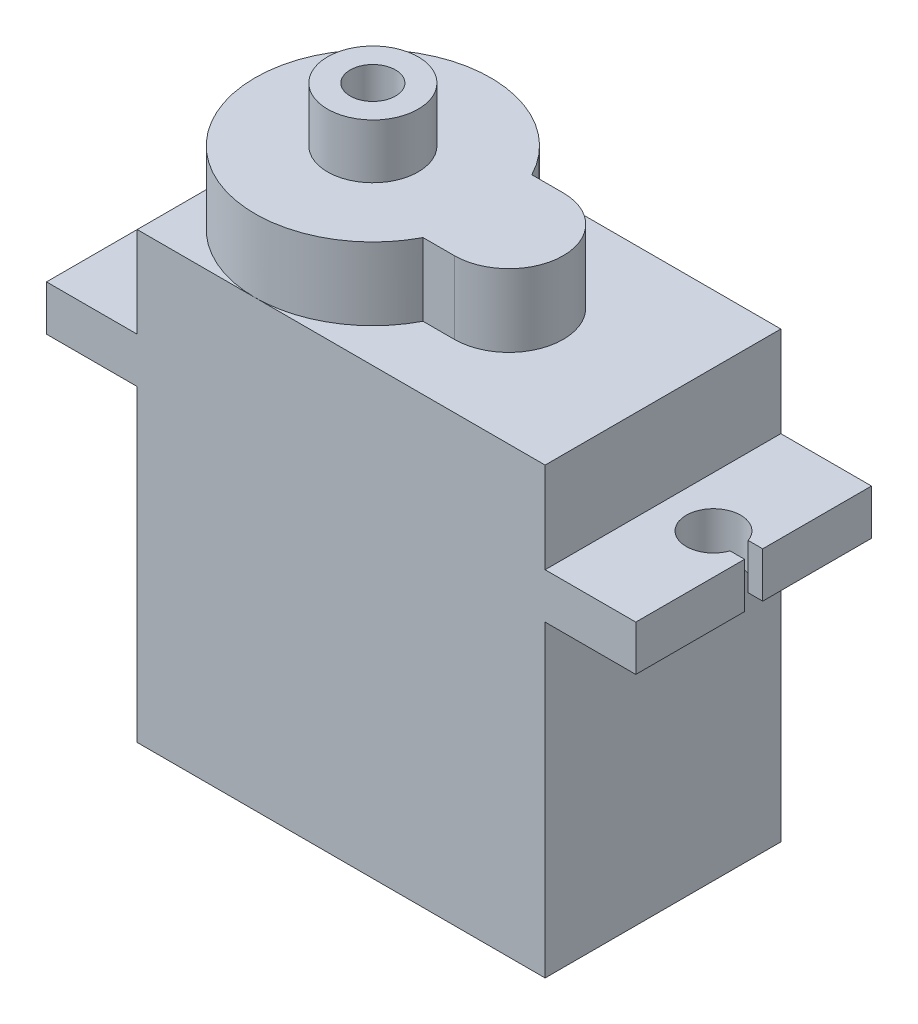
ISO-10303-21;
HEADER;
FILE_DESCRIPTION(('STEP AP214'),'2;1');
FILE_NAME('part.step','',(''),(''),'','','');
FILE_SCHEMA(('AUTOMOTIVE_DESIGN { 1 0 10303 214 1 1 1 1 }'));
ENDSEC;
DATA;
#1=APPLICATION_CONTEXT('core data for automotive mechanical design processes');
#2=APPLICATION_PROTOCOL_DEFINITION('international standard','automotive_design',2000,#1);
#3=PRODUCT_CONTEXT('',#1,'mechanical');
#4=PRODUCT('Part','Part','',(#3));
#5=PRODUCT_RELATED_PRODUCT_CATEGORY('part','',(#4));
#6=PRODUCT_DEFINITION_FORMATION('','',#4);
#7=PRODUCT_DEFINITION_CONTEXT('part definition',#1,'design');
#8=PRODUCT_DEFINITION('design','',#6,#7);
#9=PRODUCT_DEFINITION_SHAPE('','',#8);
#10=(LENGTH_UNIT() NAMED_UNIT(*) SI_UNIT(.MILLI.,.METRE.));
#11=(NAMED_UNIT(*) PLANE_ANGLE_UNIT() SI_UNIT($,.RADIAN.));
#12=(NAMED_UNIT(*) SI_UNIT($,.STERADIAN.) SOLID_ANGLE_UNIT());
#13=UNCERTAINTY_MEASURE_WITH_UNIT(LENGTH_MEASURE(1.E-05),#10,'distance_accuracy_value','');
#14=(GEOMETRIC_REPRESENTATION_CONTEXT(3) GLOBAL_UNCERTAINTY_ASSIGNED_CONTEXT((#13)) GLOBAL_UNIT_ASSIGNED_CONTEXT((#10,
#11,#12)) REPRESENTATION_CONTEXT('',''));
#15=CARTESIAN_POINT('',(0.,0.,0.));
#16=DIRECTION('',(0.,0.,1.));
#17=DIRECTION('',(1.,0.,0.));
#18=AXIS2_PLACEMENT_3D('',#15,#16,#17);
#19=CARTESIAN_POINT('',(-16.25,11.,-6.5));
#20=DIRECTION('',(-1.,0.,0.));
#21=DIRECTION('',(0.,0.,1.));
#22=AXIS2_PLACEMENT_3D('',#19,#20,#21);
#23=PLANE('',#22);
#24=DIRECTION('',(0.,1.,0.));
#25=VECTOR('',#24,1.);
#26=CARTESIAN_POINT('',(-16.25,-8.5,-0.5));
#27=LINE('',#26,#25);
#28=CARTESIAN_POINT('',(-16.25,8.5,-0.5));
#29=VERTEX_POINT('',#28);
#30=CARTESIAN_POINT('',(-16.25,11.,-0.5));
#31=VERTEX_POINT('',#30);
#32=EDGE_CURVE('E214',#29,#31,#27,.T.);
#33=ORIENTED_EDGE('',*,*,#32,.T.);
#34=DIRECTION('',(0.,0.,1.));
#35=VECTOR('',#34,1.);
#36=CARTESIAN_POINT('',(-16.25,11.,-6.5));
#37=LINE('',#36,#35);
#38=CARTESIAN_POINT('',(-16.25,11.,-6.5));
#39=VERTEX_POINT('',#38);
#40=EDGE_CURVE('E279',#39,#31,#37,.T.);
#41=ORIENTED_EDGE('',*,*,#40,.F.);
#42=DIRECTION('',(0.,-1.,0.));
#43=VECTOR('',#42,1.);
#44=CARTESIAN_POINT('',(-16.25,11.,-6.5));
#45=LINE('',#44,#43);
#46=CARTESIAN_POINT('',(-16.25,8.5,-6.5));
#47=VERTEX_POINT('',#46);
#48=EDGE_CURVE('E361',#39,#47,#45,.T.);
#49=ORIENTED_EDGE('',*,*,#48,.T.);
#50=DIRECTION('',(0.,0.,1.));
#51=VECTOR('',#50,1.);
#52=CARTESIAN_POINT('',(-16.25,8.5,-6.5));
#53=LINE('',#52,#51);
#54=EDGE_CURVE('E288',#47,#29,#53,.T.);
#55=ORIENTED_EDGE('',*,*,#54,.T.);
#56=EDGE_LOOP('',(#33,#41,#49,#55));
#57=FACE_BOUND('',#56,.T.);
#58=ADVANCED_FACE('F38',(#57),#23,.T.);
#59=CARTESIAN_POINT('',(16.25,8.5,-6.5));
#60=DIRECTION('',(1.,0.,0.));
#61=DIRECTION('',(0.,0.,-1.));
#62=AXIS2_PLACEMENT_3D('',#59,#60,#61);
#63=PLANE('',#62);
#64=DIRECTION('',(0.,1.,0.));
#65=VECTOR('',#64,1.);
#66=CARTESIAN_POINT('',(16.25,-8.5,-0.499999999999999));
#67=LINE('',#66,#65);
#68=CARTESIAN_POINT('',(16.25,8.5,-0.499999999999999));
#69=VERTEX_POINT('',#68);
#70=CARTESIAN_POINT('',(16.25,11.,-0.499999999999999));
#71=VERTEX_POINT('',#70);
#72=EDGE_CURVE('E223',#69,#71,#67,.T.);
#73=ORIENTED_EDGE('',*,*,#72,.F.);
#74=DIRECTION('',(0.,0.,1.));
#75=VECTOR('',#74,1.);
#76=CARTESIAN_POINT('',(16.25,8.5,-6.5));
#77=LINE('',#76,#75);
#78=CARTESIAN_POINT('',(16.25,8.5,-6.5));
#79=VERTEX_POINT('',#78);
#80=EDGE_CURVE('E231',#79,#69,#77,.T.);
#81=ORIENTED_EDGE('',*,*,#80,.F.);
#82=DIRECTION('',(0.,1.,0.));
#83=VECTOR('',#82,1.);
#84=CARTESIAN_POINT('',(16.25,8.5,-6.5));
#85=LINE('',#84,#83);
#86=CARTESIAN_POINT('',(16.25,11.,-6.5));
#87=VERTEX_POINT('',#86);
#88=EDGE_CURVE('E347',#79,#87,#85,.T.);
#89=ORIENTED_EDGE('',*,*,#88,.T.);
#90=DIRECTION('',(0.,0.,1.));
#91=VECTOR('',#90,1.);
#92=CARTESIAN_POINT('',(16.25,11.,-6.5));
#93=LINE('',#92,#91);
#94=EDGE_CURVE('E230',#87,#71,#93,.T.);
#95=ORIENTED_EDGE('',*,*,#94,.T.);
#96=EDGE_LOOP('',(#73,#81,#89,#95));
#97=FACE_BOUND('',#96,.T.);
#98=ADVANCED_FACE('F470',(#97),#63,.T.);
#99=CARTESIAN_POINT('',(11.25,16.,-6.5));
#100=DIRECTION('',(0.,1.,0.));
#101=DIRECTION('',(-1.,0.,0.));
#102=AXIS2_PLACEMENT_3D('',#99,#100,#101);
#103=PLANE('',#102);
#104=CARTESIAN_POINT('',(-4.75,16.,0.));
#105=DIRECTION('',(0.,1.,0.));
#106=DIRECTION('',(-1.,0.,0.));
#107=AXIS2_PLACEMENT_3D('',#104,#105,#106);
#108=CIRCLE('',#107,6.5);
#109=CARTESIAN_POINT('',(1.0162812973354,16.,-3.));
#110=VERTEX_POINT('',#109);
#111=CARTESIAN_POINT('',(-4.75,16.,-6.5));
#112=VERTEX_POINT('',#111);
#113=EDGE_CURVE('E371',#110,#112,#108,.T.);
#114=ORIENTED_EDGE('',*,*,#113,.F.);
#115=DIRECTION('',(1.,0.,0.));
#116=VECTOR('',#115,1.);
#117=CARTESIAN_POINT('',(0.,16.,-3.));
#118=LINE('',#117,#116);
#119=CARTESIAN_POINT('',(2.75,16.,-3.));
#120=VERTEX_POINT('',#119);
#121=EDGE_CURVE('E395',#110,#120,#118,.T.);
#122=ORIENTED_EDGE('',*,*,#121,.T.);
#123=CARTESIAN_POINT('',(2.75,16.,0.));
#124=DIRECTION('',(0.,1.,0.));
#125=DIRECTION('',(-1.,0.,0.));
#126=AXIS2_PLACEMENT_3D('',#123,#124,#125);
#127=CIRCLE('',#126,3.);
#128=CARTESIAN_POINT('',(2.75,16.,3.));
#129=VERTEX_POINT('',#128);
#130=EDGE_CURVE('E407',#129,#120,#127,.T.);
#131=ORIENTED_EDGE('',*,*,#130,.F.);
#132=DIRECTION('',(1.,0.,0.));
#133=VECTOR('',#132,1.);
#134=CARTESIAN_POINT('',(0.,16.,3.));
#135=LINE('',#134,#133);
#136=CARTESIAN_POINT('',(1.0162812973354,16.,3.));
#137=VERTEX_POINT('',#136);
#138=EDGE_CURVE('E404',#137,#129,#135,.T.);
#139=ORIENTED_EDGE('',*,*,#138,.F.);
#140=CARTESIAN_POINT('',(-4.75,16.,6.5));
#141=VERTEX_POINT('',#140);
#142=EDGE_CURVE('E365',#141,#137,#108,.T.);
#143=ORIENTED_EDGE('',*,*,#142,.F.);
#144=DIRECTION('',(-1.,0.,0.));
#145=VECTOR('',#144,1.);
#146=CARTESIAN_POINT('',(11.25,16.,6.5));
#147=LINE('',#146,#145);
#148=CARTESIAN_POINT('',(11.25,16.,6.5));
#149=VERTEX_POINT('',#148);
#150=EDGE_CURVE('E319',#149,#141,#147,.T.);
#151=ORIENTED_EDGE('',*,*,#150,.F.);
#152=DIRECTION('',(0.,0.,1.));
#153=VECTOR('',#152,1.);
#154=CARTESIAN_POINT('',(11.25,16.,-6.5));
#155=LINE('',#154,#153);
#156=CARTESIAN_POINT('',(11.25,16.,-6.5));
#157=VERTEX_POINT('',#156);
#158=EDGE_CURVE('E297',#157,#149,#155,.T.);
#159=ORIENTED_EDGE('',*,*,#158,.F.);
#160=DIRECTION('',(-1.,0.,0.));
#161=VECTOR('',#160,1.);
#162=CARTESIAN_POINT('',(11.25,16.,-6.5));
#163=LINE('',#162,#161);
#164=EDGE_CURVE('E354',#157,#112,#163,.T.);
#165=ORIENTED_EDGE('',*,*,#164,.T.);
#166=EDGE_LOOP('',(#114,#122,#131,#139,#143,#151,#159,#165));
#167=FACE_BOUND('',#166,.T.);
#168=ADVANCED_FACE('F491',(#167),#103,.T.);
#169=CARTESIAN_POINT('',(-11.25,16.,0.));
#170=VERTEX_POINT('',#169);
#171=EDGE_CURVE('E251',#112,#170,#108,.T.);
#172=ORIENTED_EDGE('',*,*,#171,.F.);
#173=CARTESIAN_POINT('',(-11.25,16.,-6.5));
#174=VERTEX_POINT('',#173);
#175=EDGE_CURVE('E353',#112,#174,#163,.T.);
#176=ORIENTED_EDGE('',*,*,#175,.T.);
#177=DIRECTION('',(0.,0.,1.));
#178=VECTOR('',#177,1.);
#179=CARTESIAN_POINT('',(-11.25,16.,-6.5));
#180=LINE('',#179,#178);
#181=EDGE_CURVE('E294',#174,#170,#180,.T.);
#182=ORIENTED_EDGE('',*,*,#181,.T.);
#183=EDGE_LOOP('',(#172,#176,#182));
#184=FACE_BOUND('',#183,.T.);
#185=ADVANCED_FACE('F504',(#184),#103,.T.);
#186=CARTESIAN_POINT('',(-11.25,8.5,-6.5));
#187=DIRECTION('',(-1.,0.,0.));
#188=DIRECTION('',(0.,-1.,0.));
#189=AXIS2_PLACEMENT_3D('',#186,#187,#188);
#190=PLANE('',#189);
#191=DIRECTION('',(0.,0.,1.));
#192=VECTOR('',#191,1.);
#193=CARTESIAN_POINT('',(-11.25,-8.5,-6.5));
#194=LINE('',#193,#192);
#195=CARTESIAN_POINT('',(-11.25,-8.5,-6.5));
#196=VERTEX_POINT('',#195);
#197=CARTESIAN_POINT('',(-11.25,-8.5,6.5));
#198=VERTEX_POINT('',#197);
#199=EDGE_CURVE('E244',#196,#198,#194,.T.);
#200=ORIENTED_EDGE('',*,*,#199,.T.);
#201=DIRECTION('',(0.,-1.,0.));
#202=VECTOR('',#201,1.);
#203=CARTESIAN_POINT('',(-11.25,8.5,6.5));
#204=LINE('',#203,#202);
#205=CARTESIAN_POINT('',(-11.25,8.5,6.5));
#206=VERTEX_POINT('',#205);
#207=EDGE_CURVE('E422',#206,#198,#204,.T.);
#208=ORIENTED_EDGE('',*,*,#207,.F.);
#209=DIRECTION('',(0.,0.,1.));
#210=VECTOR('',#209,1.);
#211=CARTESIAN_POINT('',(-11.25,8.5,-6.5));
#212=LINE('',#211,#210);
#213=CARTESIAN_POINT('',(-11.25,8.5,-6.5));
#214=VERTEX_POINT('',#213);
#215=EDGE_CURVE('E364',#214,#206,#212,.T.);
#216=ORIENTED_EDGE('',*,*,#215,.F.);
#217=DIRECTION('',(0.,-1.,0.));
#218=VECTOR('',#217,1.);
#219=CARTESIAN_POINT('',(-11.25,8.5,-6.5));
#220=LINE('',#219,#218);
#221=EDGE_CURVE('E335',#214,#196,#220,.T.);
#222=ORIENTED_EDGE('',*,*,#221,.T.);
#223=EDGE_LOOP('',(#200,#208,#216,#222));
#224=FACE_BOUND('',#223,.T.);
#225=ADVANCED_FACE('F40',(#224),#190,.T.);
#226=CARTESIAN_POINT('',(-16.25,8.5,-6.5));
#227=DIRECTION('',(0.,-1.,0.));
#228=DIRECTION('',(0.,0.,-1.));
#229=AXIS2_PLACEMENT_3D('',#226,#227,#228);
#230=PLANE('',#229);
#231=DIRECTION('',(1.,0.,0.));
#232=VECTOR('',#231,1.);
#233=CARTESIAN_POINT('',(-16.25,8.5,-0.5));
#234=LINE('',#233,#232);
#235=CARTESIAN_POINT('',(-15.45,8.5,-0.5));
#236=VERTEX_POINT('',#235);
#237=EDGE_CURVE('E274',#29,#236,#234,.T.);
#238=ORIENTED_EDGE('',*,*,#237,.F.);
#239=ORIENTED_EDGE('',*,*,#54,.F.);
#240=DIRECTION('',(1.,0.,0.));
#241=VECTOR('',#240,1.);
#242=CARTESIAN_POINT('',(-16.25,8.5,-6.5));
#243=LINE('',#242,#241);
#244=EDGE_CURVE('E246',#47,#214,#243,.T.);
#245=ORIENTED_EDGE('',*,*,#244,.T.);
#246=ORIENTED_EDGE('',*,*,#215,.T.);
#247=DIRECTION('',(1.,0.,0.));
#248=VECTOR('',#247,1.);
#249=CARTESIAN_POINT('',(-16.25,8.5,6.5));
#250=LINE('',#249,#248);
#251=CARTESIAN_POINT('',(-16.25,8.5,6.5));
#252=VERTEX_POINT('',#251);
#253=EDGE_CURVE('E332',#252,#206,#250,.T.);
#254=ORIENTED_EDGE('',*,*,#253,.F.);
#255=CARTESIAN_POINT('',(-16.25,8.5,0.5));
#256=VERTEX_POINT('',#255);
#257=EDGE_CURVE('E285',#256,#252,#53,.T.);
#258=ORIENTED_EDGE('',*,*,#257,.F.);
#259=DIRECTION('',(-1.,0.,0.));
#260=VECTOR('',#259,1.);
#261=CARTESIAN_POINT('',(-16.25,8.5,0.5));
#262=LINE('',#261,#260);
#263=CARTESIAN_POINT('',(-15.45,8.5,0.5));
#264=VERTEX_POINT('',#263);
#265=EDGE_CURVE('E382',#264,#256,#262,.T.);
#266=ORIENTED_EDGE('',*,*,#265,.F.);
#267=CARTESIAN_POINT('',(-14.0357864376269,8.5,0.));
#268=DIRECTION('',(0.,-1.,0.));
#269=DIRECTION('',(0.,0.,-1.));
#270=AXIS2_PLACEMENT_3D('',#267,#268,#269);
#271=CIRCLE('',#270,1.5);
#272=EDGE_CURVE('E376',#236,#264,#271,.T.);
#273=ORIENTED_EDGE('',*,*,#272,.F.);
#274=EDGE_LOOP('',(#238,#239,#245,#246,#254,#258,#266,#273));
#275=FACE_BOUND('',#274,.T.);
#276=ADVANCED_FACE('F374',(#275),#230,.T.);
#277=DIRECTION('',(0.,1.,0.));
#278=VECTOR('',#277,1.);
#279=CARTESIAN_POINT('',(-16.25,-8.5,0.5));
#280=LINE('',#279,#278);
#281=CARTESIAN_POINT('',(-16.25,11.,0.499999999999998));
#282=VERTEX_POINT('',#281);
#283=EDGE_CURVE('E53',#256,#282,#280,.T.);
#284=ORIENTED_EDGE('',*,*,#283,.F.);
#285=ORIENTED_EDGE('',*,*,#257,.T.);
#286=DIRECTION('',(0.,-1.,0.));
#287=VECTOR('',#286,1.);
#288=CARTESIAN_POINT('',(-16.25,11.,6.5));
#289=LINE('',#288,#287);
#290=CARTESIAN_POINT('',(-16.25,11.,6.5));
#291=VERTEX_POINT('',#290);
#292=EDGE_CURVE('E329',#291,#252,#289,.T.);
#293=ORIENTED_EDGE('',*,*,#292,.F.);
#294=EDGE_CURVE('E286',#282,#291,#37,.T.);
#295=ORIENTED_EDGE('',*,*,#294,.F.);
#296=EDGE_LOOP('',(#284,#285,#293,#295));
#297=FACE_BOUND('',#296,.T.);
#298=ADVANCED_FACE('F451',(#297),#23,.T.);
#299=CARTESIAN_POINT('',(-11.25,11.,-6.5));
#300=DIRECTION('',(0.,1.,0.));
#301=DIRECTION('',(0.,0.,1.));
#302=AXIS2_PLACEMENT_3D('',#299,#300,#301);
#303=PLANE('',#302);
#304=DIRECTION('',(-1.,0.,0.));
#305=VECTOR('',#304,1.);
#306=CARTESIAN_POINT('',(-11.25,11.,-0.5));
#307=LINE('',#306,#305);
#308=CARTESIAN_POINT('',(-15.45,11.,-0.5));
#309=VERTEX_POINT('',#308);
#310=EDGE_CURVE('E11',#309,#31,#307,.T.);
#311=ORIENTED_EDGE('',*,*,#310,.F.);
#312=CARTESIAN_POINT('',(-14.0357864376269,11.,0.));
#313=DIRECTION('',(0.,1.,0.));
#314=DIRECTION('',(0.,0.,1.));
#315=AXIS2_PLACEMENT_3D('',#312,#313,#314);
#316=CIRCLE('',#315,1.5);
#317=CARTESIAN_POINT('',(-15.45,11.,0.5));
#318=VERTEX_POINT('',#317);
#319=EDGE_CURVE('E46',#318,#309,#316,.T.);
#320=ORIENTED_EDGE('',*,*,#319,.F.);
#321=DIRECTION('',(1.,0.,0.));
#322=VECTOR('',#321,1.);
#323=CARTESIAN_POINT('',(-11.25,11.,0.499999999999999));
#324=LINE('',#323,#322);
#325=EDGE_CURVE('E257',#282,#318,#324,.T.);
#326=ORIENTED_EDGE('',*,*,#325,.F.);
#327=ORIENTED_EDGE('',*,*,#294,.T.);
#328=DIRECTION('',(-1.,0.,0.));
#329=VECTOR('',#328,1.);
#330=CARTESIAN_POINT('',(-11.25,11.,6.5));
#331=LINE('',#330,#329);
#332=CARTESIAN_POINT('',(-11.25,11.,6.5));
#333=VERTEX_POINT('',#332);
#334=EDGE_CURVE('E326',#333,#291,#331,.T.);
#335=ORIENTED_EDGE('',*,*,#334,.F.);
#336=DIRECTION('',(0.,0.,1.));
#337=VECTOR('',#336,1.);
#338=CARTESIAN_POINT('',(-11.25,11.,-6.5));
#339=LINE('',#338,#337);
#340=CARTESIAN_POINT('',(-11.25,11.,-6.5));
#341=VERTEX_POINT('',#340);
#342=EDGE_CURVE('E290',#341,#333,#339,.T.);
#343=ORIENTED_EDGE('',*,*,#342,.F.);
#344=DIRECTION('',(-1.,0.,0.));
#345=VECTOR('',#344,1.);
#346=CARTESIAN_POINT('',(-11.25,11.,-6.5));
#347=LINE('',#346,#345);
#348=EDGE_CURVE('E281',#341,#39,#347,.T.);
#349=ORIENTED_EDGE('',*,*,#348,.T.);
#350=ORIENTED_EDGE('',*,*,#40,.T.);
#351=EDGE_LOOP('',(#311,#320,#326,#327,#335,#343,#349,#350));
#352=FACE_BOUND('',#351,.T.);
#353=ADVANCED_FACE('F277',(#352),#303,.T.);
#354=CARTESIAN_POINT('',(-11.25,16.,-6.5));
#355=DIRECTION('',(-1.,0.,0.));
#356=DIRECTION('',(0.,0.,1.));
#357=AXIS2_PLACEMENT_3D('',#354,#355,#356);
#358=PLANE('',#357);
#359=ORIENTED_EDGE('',*,*,#342,.T.);
#360=DIRECTION('',(0.,-1.,0.));
#361=VECTOR('',#360,1.);
#362=CARTESIAN_POINT('',(-11.25,16.,6.5));
#363=LINE('',#362,#361);
#364=CARTESIAN_POINT('',(-11.25,16.,6.5));
#365=VERTEX_POINT('',#364);
#366=EDGE_CURVE('E323',#365,#333,#363,.T.);
#367=ORIENTED_EDGE('',*,*,#366,.F.);
#368=EDGE_CURVE('E296',#170,#365,#180,.T.);
#369=ORIENTED_EDGE('',*,*,#368,.F.);
#370=ORIENTED_EDGE('',*,*,#181,.F.);
#371=DIRECTION('',(0.,-1.,0.));
#372=VECTOR('',#371,1.);
#373=CARTESIAN_POINT('',(-11.25,16.,-6.5));
#374=LINE('',#373,#372);
#375=EDGE_CURVE('E357',#174,#341,#374,.T.);
#376=ORIENTED_EDGE('',*,*,#375,.T.);
#377=EDGE_LOOP('',(#359,#367,#369,#370,#376));
#378=FACE_BOUND('',#377,.T.);
#379=ADVANCED_FACE('F500',(#378),#358,.T.);
#380=EDGE_CURVE('E369',#170,#141,#108,.T.);
#381=ORIENTED_EDGE('',*,*,#380,.F.);
#382=ORIENTED_EDGE('',*,*,#368,.T.);
#383=EDGE_CURVE('E317',#141,#365,#147,.T.);
#384=ORIENTED_EDGE('',*,*,#383,.F.);
#385=EDGE_LOOP('',(#381,#382,#384));
#386=FACE_BOUND('',#385,.T.);
#387=ADVANCED_FACE('F708',(#386),#103,.T.);
#388=CARTESIAN_POINT('',(11.25,11.,-6.5));
#389=DIRECTION('',(1.,0.,0.));
#390=DIRECTION('',(0.,0.,-1.));
#391=AXIS2_PLACEMENT_3D('',#388,#389,#390);
#392=PLANE('',#391);
#393=ORIENTED_EDGE('',*,*,#158,.T.);
#394=DIRECTION('',(0.,1.,0.));
#395=VECTOR('',#394,1.);
#396=CARTESIAN_POINT('',(11.25,11.,6.5));
#397=LINE('',#396,#395);
#398=CARTESIAN_POINT('',(11.25,11.,6.5));
#399=VERTEX_POINT('',#398);
#400=EDGE_CURVE('E311',#399,#149,#397,.T.);
#401=ORIENTED_EDGE('',*,*,#400,.F.);
#402=DIRECTION('',(0.,0.,1.));
#403=VECTOR('',#402,1.);
#404=CARTESIAN_POINT('',(11.25,11.,-6.5));
#405=LINE('',#404,#403);
#406=CARTESIAN_POINT('',(11.25,11.,-6.5));
#407=VERTEX_POINT('',#406);
#408=EDGE_CURVE('E234',#407,#399,#405,.T.);
#409=ORIENTED_EDGE('',*,*,#408,.F.);
#410=DIRECTION('',(0.,1.,0.));
#411=VECTOR('',#410,1.);
#412=CARTESIAN_POINT('',(11.25,11.,-6.5));
#413=LINE('',#412,#411);
#414=EDGE_CURVE('E351',#407,#157,#413,.T.);
#415=ORIENTED_EDGE('',*,*,#414,.T.);
#416=EDGE_LOOP('',(#393,#401,#409,#415));
#417=FACE_BOUND('',#416,.T.);
#418=ADVANCED_FACE('F316',(#417),#392,.T.);
#419=CARTESIAN_POINT('',(16.25,11.,-6.5));
#420=DIRECTION('',(0.,1.,0.));
#421=DIRECTION('',(-1.,0.,0.));
#422=AXIS2_PLACEMENT_3D('',#419,#420,#421);
#423=PLANE('',#422);
#424=DIRECTION('',(-1.,0.,0.));
#425=VECTOR('',#424,1.);
#426=CARTESIAN_POINT('',(16.25,11.,-0.5));
#427=LINE('',#426,#425);
#428=CARTESIAN_POINT('',(15.45,11.,-0.5));
#429=VERTEX_POINT('',#428);
#430=EDGE_CURVE('E213',#71,#429,#427,.T.);
#431=ORIENTED_EDGE('',*,*,#430,.F.);
#432=ORIENTED_EDGE('',*,*,#94,.F.);
#433=DIRECTION('',(-1.,0.,0.));
#434=VECTOR('',#433,1.);
#435=CARTESIAN_POINT('',(16.25,11.,-6.5));
#436=LINE('',#435,#434);
#437=EDGE_CURVE('E305',#87,#407,#436,.T.);
#438=ORIENTED_EDGE('',*,*,#437,.T.);
#439=ORIENTED_EDGE('',*,*,#408,.T.);
#440=DIRECTION('',(-1.,0.,0.));
#441=VECTOR('',#440,1.);
#442=CARTESIAN_POINT('',(16.25,11.,6.5));
#443=LINE('',#442,#441);
#444=CARTESIAN_POINT('',(16.25,11.,6.5));
#445=VERTEX_POINT('',#444);
#446=EDGE_CURVE('E229',#445,#399,#443,.T.);
#447=ORIENTED_EDGE('',*,*,#446,.F.);
#448=CARTESIAN_POINT('',(16.25,11.,0.5));
#449=VERTEX_POINT('',#448);
#450=EDGE_CURVE('E220',#449,#445,#93,.T.);
#451=ORIENTED_EDGE('',*,*,#450,.F.);
#452=DIRECTION('',(1.,0.,0.));
#453=VECTOR('',#452,1.);
#454=CARTESIAN_POINT('',(16.25,11.,0.5));
#455=LINE('',#454,#453);
#456=CARTESIAN_POINT('',(15.45,11.,0.499999999999999));
#457=VERTEX_POINT('',#456);
#458=EDGE_CURVE('E206',#457,#449,#455,.T.);
#459=ORIENTED_EDGE('',*,*,#458,.F.);
#460=CARTESIAN_POINT('',(14.0357864376269,11.,0.));
#461=DIRECTION('',(0.,1.,0.));
#462=DIRECTION('',(-1.,0.,0.));
#463=AXIS2_PLACEMENT_3D('',#460,#461,#462);
#464=CIRCLE('',#463,1.5);
#465=EDGE_CURVE('E442',#429,#457,#464,.T.);
#466=ORIENTED_EDGE('',*,*,#465,.F.);
#467=EDGE_LOOP('',(#431,#432,#438,#439,#447,#451,#459,#466));
#468=FACE_BOUND('',#467,.T.);
#469=ADVANCED_FACE('F227',(#468),#423,.T.);
#470=DIRECTION('',(0.,1.,0.));
#471=VECTOR('',#470,1.);
#472=CARTESIAN_POINT('',(16.25,-8.5,0.5));
#473=LINE('',#472,#471);
#474=CARTESIAN_POINT('',(16.25,8.5,0.499999999999998));
#475=VERTEX_POINT('',#474);
#476=EDGE_CURVE('E61',#475,#449,#473,.T.);
#477=ORIENTED_EDGE('',*,*,#476,.T.);
#478=ORIENTED_EDGE('',*,*,#450,.T.);
#479=DIRECTION('',(0.,1.,0.));
#480=VECTOR('',#479,1.);
#481=CARTESIAN_POINT('',(16.25,8.5,6.5));
#482=LINE('',#481,#480);
#483=CARTESIAN_POINT('',(16.25,8.5,6.5));
#484=VERTEX_POINT('',#483);
#485=EDGE_CURVE('E314',#484,#445,#482,.T.);
#486=ORIENTED_EDGE('',*,*,#485,.F.);
#487=EDGE_CURVE('E222',#475,#484,#77,.T.);
#488=ORIENTED_EDGE('',*,*,#487,.F.);
#489=EDGE_LOOP('',(#477,#478,#486,#488));
#490=FACE_BOUND('',#489,.T.);
#491=ADVANCED_FACE('F218',(#490),#63,.T.);
#492=CARTESIAN_POINT('',(11.25,8.5,-6.5));
#493=DIRECTION('',(0.,-1.,0.));
#494=DIRECTION('',(0.,0.,-1.));
#495=AXIS2_PLACEMENT_3D('',#492,#493,#494);
#496=PLANE('',#495);
#497=DIRECTION('',(1.,0.,0.));
#498=VECTOR('',#497,1.);
#499=CARTESIAN_POINT('',(11.25,8.5,-0.5));
#500=LINE('',#499,#498);
#501=CARTESIAN_POINT('',(15.45,8.5,-0.5));
#502=VERTEX_POINT('',#501);
#503=EDGE_CURVE('E255',#502,#69,#500,.T.);
#504=ORIENTED_EDGE('',*,*,#503,.F.);
#505=CARTESIAN_POINT('',(14.0357864376269,8.5,0.));
#506=DIRECTION('',(0.,-1.,0.));
#507=DIRECTION('',(0.,0.,-1.));
#508=AXIS2_PLACEMENT_3D('',#505,#506,#507);
#509=CIRCLE('',#508,1.5);
#510=CARTESIAN_POINT('',(15.45,8.5,0.499999999999999));
#511=VERTEX_POINT('',#510);
#512=EDGE_CURVE('E253',#511,#502,#509,.T.);
#513=ORIENTED_EDGE('',*,*,#512,.F.);
#514=DIRECTION('',(-1.,0.,0.));
#515=VECTOR('',#514,1.);
#516=CARTESIAN_POINT('',(11.25,8.5,0.499999999999999));
#517=LINE('',#516,#515);
#518=EDGE_CURVE('E250',#475,#511,#517,.T.);
#519=ORIENTED_EDGE('',*,*,#518,.F.);
#520=ORIENTED_EDGE('',*,*,#487,.T.);
#521=DIRECTION('',(1.,0.,0.));
#522=VECTOR('',#521,1.);
#523=CARTESIAN_POINT('',(11.25,8.5,6.5));
#524=LINE('',#523,#522);
#525=CARTESIAN_POINT('',(11.25,8.5,6.5));
#526=VERTEX_POINT('',#525);
#527=EDGE_CURVE('E430',#526,#484,#524,.T.);
#528=ORIENTED_EDGE('',*,*,#527,.F.);
#529=DIRECTION('',(0.,0.,1.));
#530=VECTOR('',#529,1.);
#531=CARTESIAN_POINT('',(11.25,8.5,-6.5));
#532=LINE('',#531,#530);
#533=CARTESIAN_POINT('',(11.25,8.5,-6.5));
#534=VERTEX_POINT('',#533);
#535=EDGE_CURVE('E240',#534,#526,#532,.T.);
#536=ORIENTED_EDGE('',*,*,#535,.F.);
#537=DIRECTION('',(1.,0.,0.));
#538=VECTOR('',#537,1.);
#539=CARTESIAN_POINT('',(11.25,8.5,-6.5));
#540=LINE('',#539,#538);
#541=EDGE_CURVE('E344',#534,#79,#540,.T.);
#542=ORIENTED_EDGE('',*,*,#541,.T.);
#543=ORIENTED_EDGE('',*,*,#80,.T.);
#544=EDGE_LOOP('',(#504,#513,#519,#520,#528,#536,#542,#543));
#545=FACE_BOUND('',#544,.T.);
#546=ADVANCED_FACE('F435',(#545),#496,.T.);
#547=CARTESIAN_POINT('',(11.25,-8.5,-6.5));
#548=DIRECTION('',(1.,0.,0.));
#549=DIRECTION('',(0.,0.,-1.));
#550=AXIS2_PLACEMENT_3D('',#547,#548,#549);
#551=PLANE('',#550);
#552=ORIENTED_EDGE('',*,*,#535,.T.);
#553=DIRECTION('',(0.,1.,0.));
#554=VECTOR('',#553,1.);
#555=CARTESIAN_POINT('',(11.25,-8.5,6.5));
#556=LINE('',#555,#554);
#557=CARTESIAN_POINT('',(11.25,-8.5,6.5));
#558=VERTEX_POINT('',#557);
#559=EDGE_CURVE('E427',#558,#526,#556,.T.);
#560=ORIENTED_EDGE('',*,*,#559,.F.);
#561=DIRECTION('',(0.,0.,1.));
#562=VECTOR('',#561,1.);
#563=CARTESIAN_POINT('',(11.25,-8.5,-6.5));
#564=LINE('',#563,#562);
#565=CARTESIAN_POINT('',(11.25,-8.5,-6.5));
#566=VERTEX_POINT('',#565);
#567=EDGE_CURVE('E242',#566,#558,#564,.T.);
#568=ORIENTED_EDGE('',*,*,#567,.F.);
#569=DIRECTION('',(0.,1.,0.));
#570=VECTOR('',#569,1.);
#571=CARTESIAN_POINT('',(11.25,-8.5,-6.5));
#572=LINE('',#571,#570);
#573=EDGE_CURVE('E341',#566,#534,#572,.T.);
#574=ORIENTED_EDGE('',*,*,#573,.T.);
#575=EDGE_LOOP('',(#552,#560,#568,#574));
#576=FACE_BOUND('',#575,.T.);
#577=ADVANCED_FACE('F463',(#576),#551,.T.);
#578=CARTESIAN_POINT('',(-11.25,-8.5,-6.5));
#579=DIRECTION('',(0.,-1.,0.));
#580=DIRECTION('',(0.,0.,-1.));
#581=AXIS2_PLACEMENT_3D('',#578,#579,#580);
#582=PLANE('',#581);
#583=ORIENTED_EDGE('',*,*,#567,.T.);
#584=DIRECTION('',(1.,0.,0.));
#585=VECTOR('',#584,1.);
#586=CARTESIAN_POINT('',(-11.25,-8.5,6.5));
#587=LINE('',#586,#585);
#588=EDGE_CURVE('E424',#198,#558,#587,.T.);
#589=ORIENTED_EDGE('',*,*,#588,.F.);
#590=ORIENTED_EDGE('',*,*,#199,.F.);
#591=DIRECTION('',(1.,0.,0.));
#592=VECTOR('',#591,1.);
#593=CARTESIAN_POINT('',(-11.25,-8.5,-6.5));
#594=LINE('',#593,#592);
#595=EDGE_CURVE('E338',#196,#566,#594,.T.);
#596=ORIENTED_EDGE('',*,*,#595,.T.);
#597=EDGE_LOOP('',(#583,#589,#590,#596));
#598=FACE_BOUND('',#597,.T.);
#599=ADVANCED_FACE('F461',(#598),#582,.T.);
#600=CARTESIAN_POINT('',(0.,0.,-6.5));
#601=DIRECTION('',(0.,0.,1.));
#602=DIRECTION('',(1.,0.,0.));
#603=AXIS2_PLACEMENT_3D('',#600,#601,#602);
#604=PLANE('',#603);
#605=ORIENTED_EDGE('',*,*,#221,.F.);
#606=ORIENTED_EDGE('',*,*,#244,.F.);
#607=ORIENTED_EDGE('',*,*,#48,.F.);
#608=ORIENTED_EDGE('',*,*,#348,.F.);
#609=ORIENTED_EDGE('',*,*,#375,.F.);
#610=ORIENTED_EDGE('',*,*,#175,.F.);
#611=ORIENTED_EDGE('',*,*,#164,.F.);
#612=ORIENTED_EDGE('',*,*,#414,.F.);
#613=ORIENTED_EDGE('',*,*,#437,.F.);
#614=ORIENTED_EDGE('',*,*,#88,.F.);
#615=ORIENTED_EDGE('',*,*,#541,.F.);
#616=ORIENTED_EDGE('',*,*,#573,.F.);
#617=ORIENTED_EDGE('',*,*,#595,.F.);
#618=EDGE_LOOP('',(#605,#606,#607,#608,#609,#610,#611,#612,#613,#614,#615,#616,#617));
#619=FACE_BOUND('',#618,.T.);
#620=ADVANCED_FACE('F466',(#619),#604,.F.);
#621=CARTESIAN_POINT('',(0.,0.,6.5));
#622=DIRECTION('',(0.,0.,1.));
#623=DIRECTION('',(1.,0.,0.));
#624=AXIS2_PLACEMENT_3D('',#621,#622,#623);
#625=PLANE('',#624);
#626=ORIENTED_EDGE('',*,*,#207,.T.);
#627=ORIENTED_EDGE('',*,*,#588,.T.);
#628=ORIENTED_EDGE('',*,*,#559,.T.);
#629=ORIENTED_EDGE('',*,*,#527,.T.);
#630=ORIENTED_EDGE('',*,*,#485,.T.);
#631=ORIENTED_EDGE('',*,*,#446,.T.);
#632=ORIENTED_EDGE('',*,*,#400,.T.);
#633=ORIENTED_EDGE('',*,*,#150,.T.);
#634=ORIENTED_EDGE('',*,*,#383,.T.);
#635=ORIENTED_EDGE('',*,*,#366,.T.);
#636=ORIENTED_EDGE('',*,*,#334,.T.);
#637=ORIENTED_EDGE('',*,*,#292,.T.);
#638=ORIENTED_EDGE('',*,*,#253,.T.);
#639=EDGE_LOOP('',(#626,#627,#628,#629,#630,#631,#632,#633,#634,#635,#636,#637,#638));
#640=FACE_BOUND('',#639,.T.);
#641=ADVANCED_FACE('F309',(#640),#625,.T.);
#642=CARTESIAN_POINT('',(-4.75,20.,0.));
#643=DIRECTION('',(0.,-1.,0.));
#644=DIRECTION('',(1.,0.,0.));
#645=AXIS2_PLACEMENT_3D('',#642,#643,#644);
#646=CYLINDRICAL_SURFACE('',#645,6.5);
#647=ORIENTED_EDGE('',*,*,#113,.T.);
#648=ORIENTED_EDGE('',*,*,#171,.T.);
#649=ORIENTED_EDGE('',*,*,#380,.T.);
#650=ORIENTED_EDGE('',*,*,#142,.T.);
#651=DIRECTION('',(0.,-1.,0.));
#652=VECTOR('',#651,1.);
#653=CARTESIAN_POINT('',(1.0162812973354,20.,3.));
#654=LINE('',#653,#652);
#655=CARTESIAN_POINT('',(1.0162812973354,20.,3.));
#656=VERTEX_POINT('',#655);
#657=EDGE_CURVE('E419',#656,#137,#654,.T.);
#658=ORIENTED_EDGE('',*,*,#657,.F.);
#659=CARTESIAN_POINT('',(-4.75,20.,0.));
#660=DIRECTION('',(0.,1.,0.));
#661=DIRECTION('',(-1.,0.,0.));
#662=AXIS2_PLACEMENT_3D('',#659,#660,#661);
#663=CIRCLE('',#662,6.5);
#664=CARTESIAN_POINT('',(1.0162812973354,20.,-3.));
#665=VERTEX_POINT('',#664);
#666=EDGE_CURVE('E391',#665,#656,#663,.T.);
#667=ORIENTED_EDGE('',*,*,#666,.F.);
#668=DIRECTION('',(0.,-1.,0.));
#669=VECTOR('',#668,1.);
#670=CARTESIAN_POINT('',(1.0162812973354,20.,-3.));
#671=LINE('',#670,#669);
#672=EDGE_CURVE('E401',#665,#110,#671,.T.);
#673=ORIENTED_EDGE('',*,*,#672,.T.);
#674=EDGE_LOOP('',(#647,#648,#649,#650,#658,#667,#673));
#675=FACE_BOUND('',#674,.T.);
#676=ADVANCED_FACE('F510',(#675),#646,.T.);
#677=CARTESIAN_POINT('',(0.,20.,3.));
#678=DIRECTION('',(0.,0.,-1.));
#679=DIRECTION('',(-1.,0.,0.));
#680=AXIS2_PLACEMENT_3D('',#677,#678,#679);
#681=PLANE('',#680);
#682=ORIENTED_EDGE('',*,*,#138,.T.);
#683=DIRECTION('',(0.,-1.,0.));
#684=VECTOR('',#683,1.);
#685=CARTESIAN_POINT('',(2.75,20.,3.));
#686=LINE('',#685,#684);
#687=CARTESIAN_POINT('',(2.75,20.,3.));
#688=VERTEX_POINT('',#687);
#689=EDGE_CURVE('E416',#688,#129,#686,.T.);
#690=ORIENTED_EDGE('',*,*,#689,.F.);
#691=DIRECTION('',(1.,0.,0.));
#692=VECTOR('',#691,1.);
#693=CARTESIAN_POINT('',(0.,20.,3.));
#694=LINE('',#693,#692);
#695=EDGE_CURVE('E394',#656,#688,#694,.T.);
#696=ORIENTED_EDGE('',*,*,#695,.F.);
#697=ORIENTED_EDGE('',*,*,#657,.T.);
#698=EDGE_LOOP('',(#682,#690,#696,#697));
#699=FACE_BOUND('',#698,.T.);
#700=ADVANCED_FACE('F513',(#699),#681,.F.);
#701=CARTESIAN_POINT('',(2.75,20.,0.));
#702=DIRECTION('',(0.,-1.,0.));
#703=DIRECTION('',(1.,0.,0.));
#704=AXIS2_PLACEMENT_3D('',#701,#702,#703);
#705=CYLINDRICAL_SURFACE('',#704,3.);
#706=ORIENTED_EDGE('',*,*,#130,.T.);
#707=DIRECTION('',(0.,-1.,0.));
#708=VECTOR('',#707,1.);
#709=CARTESIAN_POINT('',(2.75,20.,-3.));
#710=LINE('',#709,#708);
#711=CARTESIAN_POINT('',(2.75,20.,-3.));
#712=VERTEX_POINT('',#711);
#713=EDGE_CURVE('E413',#712,#120,#710,.T.);
#714=ORIENTED_EDGE('',*,*,#713,.F.);
#715=CARTESIAN_POINT('',(2.75,20.,0.));
#716=DIRECTION('',(0.,1.,0.));
#717=DIRECTION('',(-1.,0.,0.));
#718=AXIS2_PLACEMENT_3D('',#715,#716,#717);
#719=CIRCLE('',#718,3.);
#720=EDGE_CURVE('E397',#688,#712,#719,.T.);
#721=ORIENTED_EDGE('',*,*,#720,.F.);
#722=ORIENTED_EDGE('',*,*,#689,.T.);
#723=EDGE_LOOP('',(#706,#714,#721,#722));
#724=FACE_BOUND('',#723,.T.);
#725=ADVANCED_FACE('F517',(#724),#705,.T.);
#726=CARTESIAN_POINT('',(0.,20.,-3.));
#727=DIRECTION('',(0.,0.,-1.));
#728=DIRECTION('',(-1.,0.,0.));
#729=AXIS2_PLACEMENT_3D('',#726,#727,#728);
#730=PLANE('',#729);
#731=ORIENTED_EDGE('',*,*,#121,.F.);
#732=ORIENTED_EDGE('',*,*,#672,.F.);
#733=DIRECTION('',(1.,0.,0.));
#734=VECTOR('',#733,1.);
#735=CARTESIAN_POINT('',(0.,20.,-3.));
#736=LINE('',#735,#734);
#737=EDGE_CURVE('E399',#665,#712,#736,.T.);
#738=ORIENTED_EDGE('',*,*,#737,.T.);
#739=ORIENTED_EDGE('',*,*,#713,.T.);
#740=EDGE_LOOP('',(#731,#732,#738,#739));
#741=FACE_BOUND('',#740,.T.);
#742=ADVANCED_FACE('F521',(#741),#730,.T.);
#743=CARTESIAN_POINT('',(0.,20.,0.));
#744=DIRECTION('',(0.,1.,0.));
#745=DIRECTION('',(-1.,0.,0.));
#746=AXIS2_PLACEMENT_3D('',#743,#744,#745);
#747=PLANE('',#746);
#748=CARTESIAN_POINT('',(-4.75,20.,0.));
#749=DIRECTION('',(0.,1.,0.));
#750=DIRECTION('',(-1.,0.,0.));
#751=AXIS2_PLACEMENT_3D('',#748,#749,#750);
#752=CIRCLE('',#751,2.5);
#753=CARTESIAN_POINT('',(-7.25,20.,0.));
#754=VERTEX_POINT('',#753);
#755=EDGE_CURVE('E380',#754,#754,#752,.T.);
#756=ORIENTED_EDGE('',*,*,#755,.F.);
#757=EDGE_LOOP('',(#756));
#758=FACE_BOUND('',#757,.T.);
#759=ORIENTED_EDGE('',*,*,#666,.T.);
#760=ORIENTED_EDGE('',*,*,#695,.T.);
#761=ORIENTED_EDGE('',*,*,#720,.T.);
#762=ORIENTED_EDGE('',*,*,#737,.F.);
#763=EDGE_LOOP('',(#759,#760,#761,#762));
#764=FACE_BOUND('',#763,.T.);
#765=ADVANCED_FACE('F525',(#758,#764),#747,.T.);
#766=CARTESIAN_POINT('',(-4.75,23.,0.));
#767=DIRECTION('',(0.,1.,0.));
#768=DIRECTION('',(-1.,0.,0.));
#769=AXIS2_PLACEMENT_3D('',#766,#767,#768);
#770=PLANE('',#769);
#771=CARTESIAN_POINT('',(-4.75,23.,0.));
#772=DIRECTION('',(0.,1.,0.));
#773=DIRECTION('',(-1.,0.,0.));
#774=AXIS2_PLACEMENT_3D('',#771,#772,#773);
#775=CIRCLE('',#774,2.5);
#776=CARTESIAN_POINT('',(-7.25,23.,0.));
#777=VERTEX_POINT('',#776);
#778=EDGE_CURVE('E386',#777,#777,#775,.T.);
#779=ORIENTED_EDGE('',*,*,#778,.T.);
#780=EDGE_LOOP('',(#779));
#781=FACE_BOUND('',#780,.T.);
#782=CARTESIAN_POINT('',(-4.75,23.,0.));
#783=DIRECTION('',(0.,1.,0.));
#784=DIRECTION('',(-1.,0.,0.));
#785=AXIS2_PLACEMENT_3D('',#782,#783,#784);
#786=CIRCLE('',#785,1.25);
#787=CARTESIAN_POINT('',(-6.,23.,0.));
#788=VERTEX_POINT('',#787);
#789=EDGE_CURVE('E377',#788,#788,#786,.T.);
#790=ORIENTED_EDGE('',*,*,#789,.F.);
#791=EDGE_LOOP('',(#790));
#792=FACE_BOUND('',#791,.T.);
#793=ADVANCED_FACE('F529',(#781,#792),#770,.T.);
#794=CARTESIAN_POINT('',(-4.75,23.,0.));
#795=DIRECTION('',(0.,-1.,0.));
#796=DIRECTION('',(1.,0.,0.));
#797=AXIS2_PLACEMENT_3D('',#794,#795,#796);
#798=CYLINDRICAL_SURFACE('',#797,2.5);
#799=ORIENTED_EDGE('',*,*,#778,.F.);
#800=EDGE_LOOP('',(#799));
#801=FACE_BOUND('',#800,.T.);
#802=ORIENTED_EDGE('',*,*,#755,.T.);
#803=EDGE_LOOP('',(#802));
#804=FACE_BOUND('',#803,.T.);
#805=ADVANCED_FACE('F531',(#801,#804),#798,.T.);
#806=CARTESIAN_POINT('',(-4.75,23.,0.));
#807=DIRECTION('',(0.,-1.,0.));
#808=DIRECTION('',(1.,0.,0.));
#809=AXIS2_PLACEMENT_3D('',#806,#807,#808);
#810=CYLINDRICAL_SURFACE('',#809,1.25);
#811=ORIENTED_EDGE('',*,*,#789,.T.);
#812=EDGE_LOOP('',(#811));
#813=FACE_BOUND('',#812,.T.);
#814=CARTESIAN_POINT('',(-4.75,20.,0.));
#815=DIRECTION('',(0.,1.,0.));
#816=DIRECTION('',(-1.,0.,0.));
#817=AXIS2_PLACEMENT_3D('',#814,#815,#816);
#818=CIRCLE('',#817,1.25);
#819=CARTESIAN_POINT('',(-6.,20.,0.));
#820=VERTEX_POINT('',#819);
#821=EDGE_CURVE('E247',#820,#820,#818,.F.);
#822=ORIENTED_EDGE('',*,*,#821,.T.);
#823=EDGE_LOOP('',(#822));
#824=FACE_BOUND('',#823,.T.);
#825=ADVANCED_FACE('F534',(#813,#824),#810,.F.);
#826=ORIENTED_EDGE('',*,*,#821,.F.);
#827=EDGE_LOOP('',(#826));
#828=FACE_BOUND('',#827,.T.);
#829=ADVANCED_FACE('F483',(#828),#747,.T.);
#830=CARTESIAN_POINT('',(14.0357864376269,-8.5,0.));
#831=DIRECTION('',(0.,1.,0.));
#832=DIRECTION('',(0.,0.,1.));
#833=AXIS2_PLACEMENT_3D('',#830,#831,#832);
#834=CYLINDRICAL_SURFACE('',#833,1.5);
#835=ORIENTED_EDGE('',*,*,#465,.T.);
#836=DIRECTION('',(0.,1.,0.));
#837=VECTOR('',#836,1.);
#838=CARTESIAN_POINT('',(15.45,-8.5,0.499999999999999));
#839=LINE('',#838,#837);
#840=EDGE_CURVE('E209',#511,#457,#839,.T.);
#841=ORIENTED_EDGE('',*,*,#840,.F.);
#842=ORIENTED_EDGE('',*,*,#512,.T.);
#843=DIRECTION('',(0.,1.,0.));
#844=VECTOR('',#843,1.);
#845=CARTESIAN_POINT('',(15.45,-8.5,-0.5));
#846=LINE('',#845,#844);
#847=EDGE_CURVE('E453',#502,#429,#846,.T.);
#848=ORIENTED_EDGE('',*,*,#847,.T.);
#849=EDGE_LOOP('',(#835,#841,#842,#848));
#850=FACE_BOUND('',#849,.T.);
#851=ADVANCED_FACE('F439',(#850),#834,.F.);
#852=CARTESIAN_POINT('',(16.25,-8.5,-0.499999999999999));
#853=DIRECTION('',(0.,0.,-1.));
#854=DIRECTION('',(-1.,0.,0.));
#855=AXIS2_PLACEMENT_3D('',#852,#853,#854);
#856=PLANE('',#855);
#857=ORIENTED_EDGE('',*,*,#430,.T.);
#858=ORIENTED_EDGE('',*,*,#847,.F.);
#859=ORIENTED_EDGE('',*,*,#503,.T.);
#860=ORIENTED_EDGE('',*,*,#72,.T.);
#861=EDGE_LOOP('',(#857,#858,#859,#860));
#862=FACE_BOUND('',#861,.T.);
#863=ADVANCED_FACE('F475',(#862),#856,.F.);
#864=CARTESIAN_POINT('',(16.25,-8.5,0.5));
#865=DIRECTION('',(0.,0.,1.));
#866=DIRECTION('',(1.,0.,0.));
#867=AXIS2_PLACEMENT_3D('',#864,#865,#866);
#868=PLANE('',#867);
#869=ORIENTED_EDGE('',*,*,#458,.T.);
#870=ORIENTED_EDGE('',*,*,#476,.F.);
#871=ORIENTED_EDGE('',*,*,#518,.T.);
#872=ORIENTED_EDGE('',*,*,#840,.T.);
#873=EDGE_LOOP('',(#869,#870,#871,#872));
#874=FACE_BOUND('',#873,.T.);
#875=ADVANCED_FACE('F207',(#874),#868,.F.);
#876=CARTESIAN_POINT('',(-16.25,-8.5,-0.5));
#877=DIRECTION('',(0.,0.,-1.));
#878=DIRECTION('',(-1.,0.,0.));
#879=AXIS2_PLACEMENT_3D('',#876,#877,#878);
#880=PLANE('',#879);
#881=ORIENTED_EDGE('',*,*,#237,.T.);
#882=DIRECTION('',(0.,1.,0.));
#883=VECTOR('',#882,1.);
#884=CARTESIAN_POINT('',(-15.45,-8.5,-0.5));
#885=LINE('',#884,#883);
#886=EDGE_CURVE('E264',#236,#309,#885,.T.);
#887=ORIENTED_EDGE('',*,*,#886,.T.);
#888=ORIENTED_EDGE('',*,*,#310,.T.);
#889=ORIENTED_EDGE('',*,*,#32,.F.);
#890=EDGE_LOOP('',(#881,#887,#888,#889));
#891=FACE_BOUND('',#890,.T.);
#892=ADVANCED_FACE('F271',(#891),#880,.F.);
#893=CARTESIAN_POINT('',(-14.0357864376269,-8.5,0.));
#894=DIRECTION('',(0.,1.,0.));
#895=DIRECTION('',(0.,0.,1.));
#896=AXIS2_PLACEMENT_3D('',#893,#894,#895);
#897=CYLINDRICAL_SURFACE('',#896,1.5);
#898=ORIENTED_EDGE('',*,*,#272,.T.);
#899=DIRECTION('',(0.,1.,0.));
#900=VECTOR('',#899,1.);
#901=CARTESIAN_POINT('',(-15.45,-8.5,0.5));
#902=LINE('',#901,#900);
#903=EDGE_CURVE('E267',#264,#318,#902,.T.);
#904=ORIENTED_EDGE('',*,*,#903,.T.);
#905=ORIENTED_EDGE('',*,*,#319,.T.);
#906=ORIENTED_EDGE('',*,*,#886,.F.);
#907=EDGE_LOOP('',(#898,#904,#905,#906));
#908=FACE_BOUND('',#907,.T.);
#909=ADVANCED_FACE('F263',(#908),#897,.F.);
#910=CARTESIAN_POINT('',(-16.25,-8.5,0.5));
#911=DIRECTION('',(0.,0.,1.));
#912=DIRECTION('',(1.,0.,0.));
#913=AXIS2_PLACEMENT_3D('',#910,#911,#912);
#914=PLANE('',#913);
#915=ORIENTED_EDGE('',*,*,#265,.T.);
#916=ORIENTED_EDGE('',*,*,#283,.T.);
#917=ORIENTED_EDGE('',*,*,#325,.T.);
#918=ORIENTED_EDGE('',*,*,#903,.F.);
#919=EDGE_LOOP('',(#915,#916,#917,#918));
#920=FACE_BOUND('',#919,.T.);
#921=ADVANCED_FACE('F447',(#920),#914,.F.);
#922=CLOSED_SHELL('',(#58,#98,#168,#185,#225,#276,#298,#353,#379,#387,#418,#469,#491,#546,#577,
#599,#620,#641,#676,#700,#725,#742,#765,#793,#805,#825,#829,#851,#863,#875,#892,#909,#921));
#923=MANIFOLD_SOLID_BREP('B2',#922);
#924=ADVANCED_BREP_SHAPE_REPRESENTATION('',(#18,#923),#14);
#925=SHAPE_DEFINITION_REPRESENTATION(#9,#924);
ENDSEC;
END-ISO-10303-21;
